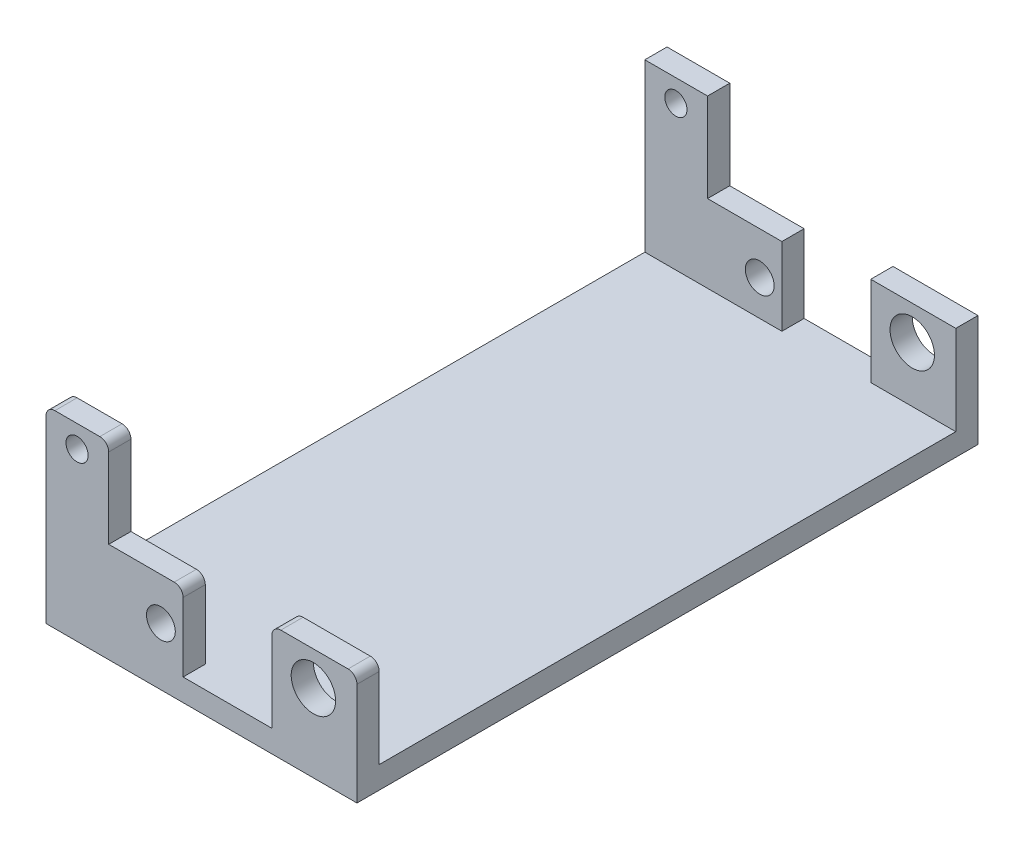
ISO-10303-21;
HEADER;
FILE_DESCRIPTION(('STEP AP214'),'2;1');
FILE_NAME('part.step','',(''),(''),'','','');
FILE_SCHEMA(('AUTOMOTIVE_DESIGN { 1 0 10303 214 1 1 1 1 }'));
ENDSEC;
DATA;
#1=APPLICATION_CONTEXT('core data for automotive mechanical design processes');
#2=APPLICATION_PROTOCOL_DEFINITION('international standard','automotive_design',2000,#1);
#3=PRODUCT_CONTEXT('',#1,'mechanical');
#4=PRODUCT('Part','Part','',(#3));
#5=PRODUCT_RELATED_PRODUCT_CATEGORY('part','',(#4));
#6=PRODUCT_DEFINITION_FORMATION('','',#4);
#7=PRODUCT_DEFINITION_CONTEXT('part definition',#1,'design');
#8=PRODUCT_DEFINITION('design','',#6,#7);
#9=PRODUCT_DEFINITION_SHAPE('','',#8);
#10=(LENGTH_UNIT() NAMED_UNIT(*) SI_UNIT(.MILLI.,.METRE.));
#11=(NAMED_UNIT(*) PLANE_ANGLE_UNIT() SI_UNIT($,.RADIAN.));
#12=(NAMED_UNIT(*) SI_UNIT($,.STERADIAN.) SOLID_ANGLE_UNIT());
#13=UNCERTAINTY_MEASURE_WITH_UNIT(LENGTH_MEASURE(1.E-05),#10,'distance_accuracy_value','');
#14=(GEOMETRIC_REPRESENTATION_CONTEXT(3) GLOBAL_UNCERTAINTY_ASSIGNED_CONTEXT((#13)) GLOBAL_UNIT_ASSIGNED_CONTEXT((#10,
#11,#12)) REPRESENTATION_CONTEXT('',''));
#15=CARTESIAN_POINT('',(0.,0.,0.));
#16=DIRECTION('',(0.,0.,1.));
#17=DIRECTION('',(1.,0.,0.));
#18=AXIS2_PLACEMENT_3D('',#15,#16,#17);
#19=CARTESIAN_POINT('',(0.,3.175,6.35));
#20=DIRECTION('',(0.,-1.,0.));
#21=DIRECTION('',(1.,0.,0.));
#22=AXIS2_PLACEMENT_3D('',#19,#20,#21);
#23=PLANE('',#22);
#24=DIRECTION('',(1.,0.,0.));
#25=VECTOR('',#24,1.);
#26=CARTESIAN_POINT('',(0.,3.175,-164.846));
#27=LINE('',#26,#25);
#28=CARTESIAN_POINT('',(-44.45,3.175,-164.846));
#29=VERTEX_POINT('',#28);
#30=CARTESIAN_POINT('',(-5.26143670644638,3.175,-164.846));
#31=VERTEX_POINT('',#30);
#32=EDGE_CURVE('E57',#29,#31,#27,.T.);
#33=ORIENTED_EDGE('',*,*,#32,.F.);
#34=DIRECTION('',(0.,0.,1.));
#35=VECTOR('',#34,1.);
#36=CARTESIAN_POINT('',(-44.45,3.175,-171.196));
#37=LINE('',#36,#35);
#38=CARTESIAN_POINT('',(-44.45,3.175,0.));
#39=VERTEX_POINT('',#38);
#40=EDGE_CURVE('E303',#29,#39,#37,.T.);
#41=ORIENTED_EDGE('',*,*,#40,.T.);
#42=DIRECTION('',(-1.,0.,0.));
#43=VECTOR('',#42,1.);
#44=CARTESIAN_POINT('',(0.,3.175,0.));
#45=LINE('',#44,#43);
#46=CARTESIAN_POINT('',(-5.26143670644638,3.175,0.));
#47=VERTEX_POINT('',#46);
#48=EDGE_CURVE('E384',#47,#39,#45,.T.);
#49=ORIENTED_EDGE('',*,*,#48,.F.);
#50=DIRECTION('',(0.,0.,-1.));
#51=VECTOR('',#50,1.);
#52=CARTESIAN_POINT('',(-5.26143670644638,3.175,6.35));
#53=LINE('',#52,#51);
#54=CARTESIAN_POINT('',(-5.26143670644638,3.175,6.35));
#55=VERTEX_POINT('',#54);
#56=EDGE_CURVE('E378',#55,#47,#53,.T.);
#57=ORIENTED_EDGE('',*,*,#56,.F.);
#58=DIRECTION('',(-1.,0.,0.));
#59=VECTOR('',#58,1.);
#60=CARTESIAN_POINT('',(0.,3.175,6.35));
#61=LINE('',#60,#59);
#62=CARTESIAN_POINT('',(20.1413299749846,3.175,6.35));
#63=VERTEX_POINT('',#62);
#64=EDGE_CURVE('E322',#63,#55,#61,.T.);
#65=ORIENTED_EDGE('',*,*,#64,.F.);
#66=DIRECTION('',(0.,0.,-1.));
#67=VECTOR('',#66,1.);
#68=CARTESIAN_POINT('',(20.1413299749846,3.175,6.35));
#69=LINE('',#68,#67);
#70=CARTESIAN_POINT('',(20.1413299749846,3.175,0.));
#71=VERTEX_POINT('',#70);
#72=EDGE_CURVE('E381',#63,#71,#69,.T.);
#73=ORIENTED_EDGE('',*,*,#72,.T.);
#74=CARTESIAN_POINT('',(44.45,3.175,0.));
#75=VERTEX_POINT('',#74);
#76=EDGE_CURVE('E387',#75,#71,#45,.T.);
#77=ORIENTED_EDGE('',*,*,#76,.F.);
#78=DIRECTION('',(0.,0.,1.));
#79=VECTOR('',#78,1.);
#80=CARTESIAN_POINT('',(44.45,3.175,-171.196));
#81=LINE('',#80,#79);
#82=CARTESIAN_POINT('',(44.45,3.175,-164.846));
#83=VERTEX_POINT('',#82);
#84=EDGE_CURVE('E302',#83,#75,#81,.T.);
#85=ORIENTED_EDGE('',*,*,#84,.F.);
#86=CARTESIAN_POINT('',(20.1413299749846,3.175,-164.846));
#87=VERTEX_POINT('',#86);
#88=EDGE_CURVE('E50',#87,#83,#27,.T.);
#89=ORIENTED_EDGE('',*,*,#88,.F.);
#90=DIRECTION('',(0.,0.,1.));
#91=VECTOR('',#90,1.);
#92=CARTESIAN_POINT('',(20.1413299749846,3.175,-171.196));
#93=LINE('',#92,#91);
#94=CARTESIAN_POINT('',(20.1413299749846,3.175,-171.196));
#95=VERTEX_POINT('',#94);
#96=EDGE_CURVE('E281',#95,#87,#93,.T.);
#97=ORIENTED_EDGE('',*,*,#96,.F.);
#98=DIRECTION('',(-1.,0.,0.));
#99=VECTOR('',#98,1.);
#100=CARTESIAN_POINT('',(-44.45,3.175,-171.196));
#101=LINE('',#100,#99);
#102=CARTESIAN_POINT('',(-5.26143670644638,3.175,-171.196));
#103=VERTEX_POINT('',#102);
#104=EDGE_CURVE('E212',#95,#103,#101,.T.);
#105=ORIENTED_EDGE('',*,*,#104,.T.);
#106=DIRECTION('',(0.,0.,1.));
#107=VECTOR('',#106,1.);
#108=CARTESIAN_POINT('',(-5.26143670644638,3.175,-171.196));
#109=LINE('',#108,#107);
#110=EDGE_CURVE('E283',#103,#31,#109,.T.);
#111=ORIENTED_EDGE('',*,*,#110,.T.);
#112=EDGE_LOOP('',(#33,#41,#49,#57,#65,#73,#77,#85,#89,#97,#105,#111));
#113=FACE_BOUND('',#112,.T.);
#114=ADVANCED_FACE('F35',(#113),#23,.F.);
#115=CARTESIAN_POINT('',(0.,0.,0.));
#116=DIRECTION('',(0.,0.,1.));
#117=DIRECTION('',(1.,0.,0.));
#118=AXIS2_PLACEMENT_3D('',#115,#116,#117);
#119=PLANE('',#118);
#120=CARTESIAN_POINT('',(31.9955052767469,19.05,0.));
#121=DIRECTION('',(0.,0.,1.));
#122=DIRECTION('',(1.,0.,0.));
#123=AXIS2_PLACEMENT_3D('',#120,#121,#122);
#124=CIRCLE('',#123,6.35000000000001);
#125=CARTESIAN_POINT('',(38.3455052767469,19.05,0.));
#126=VERTEX_POINT('',#125);
#127=EDGE_CURVE('E305',#126,#126,#124,.T.);
#128=ORIENTED_EDGE('',*,*,#127,.T.);
#129=EDGE_LOOP('',(#128));
#130=FACE_BOUND('',#129,.T.);
#131=DIRECTION('',(-1.,0.,0.));
#132=VECTOR('',#131,1.);
#133=CARTESIAN_POINT('',(0.,28.7610986747673,0.));
#134=LINE('',#133,#132);
#135=CARTESIAN_POINT('',(41.91,28.7610986747673,0.));
#136=VERTEX_POINT('',#135);
#137=CARTESIAN_POINT('',(22.6813299749846,28.7610986747673,0.));
#138=VERTEX_POINT('',#137);
#139=EDGE_CURVE('E352',#136,#138,#134,.T.);
#140=ORIENTED_EDGE('',*,*,#139,.F.);
#141=CARTESIAN_POINT('',(41.91,26.2210986747673,0.));
#142=DIRECTION('',(0.,0.,1.));
#143=DIRECTION('',(1.,0.,0.));
#144=AXIS2_PLACEMENT_3D('',#141,#142,#143);
#145=CIRCLE('',#144,2.54);
#146=CARTESIAN_POINT('',(44.45,26.2210986747673,0.));
#147=VERTEX_POINT('',#146);
#148=EDGE_CURVE('E395',#136,#147,#145,.F.);
#149=ORIENTED_EDGE('',*,*,#148,.T.);
#150=DIRECTION('',(0.,1.,0.));
#151=VECTOR('',#150,1.);
#152=CARTESIAN_POINT('',(44.45,0.,0.));
#153=LINE('',#152,#151);
#154=EDGE_CURVE('E311',#75,#147,#153,.T.);
#155=ORIENTED_EDGE('',*,*,#154,.F.);
#156=ORIENTED_EDGE('',*,*,#76,.T.);
#157=DIRECTION('',(0.,-1.,0.));
#158=VECTOR('',#157,1.);
#159=CARTESIAN_POINT('',(20.1413299749846,0.,0.));
#160=LINE('',#159,#158);
#161=CARTESIAN_POINT('',(20.1413299749846,26.2210986747673,0.));
#162=VERTEX_POINT('',#161);
#163=EDGE_CURVE('E355',#162,#71,#160,.T.);
#164=ORIENTED_EDGE('',*,*,#163,.F.);
#165=CARTESIAN_POINT('',(22.6813299749846,26.2210986747673,0.));
#166=DIRECTION('',(0.,0.,1.));
#167=DIRECTION('',(1.,0.,0.));
#168=AXIS2_PLACEMENT_3D('',#165,#166,#167);
#169=CIRCLE('',#168,2.54);
#170=EDGE_CURVE('E393',#162,#138,#169,.F.);
#171=ORIENTED_EDGE('',*,*,#170,.T.);
#172=EDGE_LOOP('',(#140,#149,#155,#156,#164,#171));
#173=FACE_BOUND('',#172,.T.);
#174=ADVANCED_FACE('F476',(#130,#173),#119,.F.);
#175=CARTESIAN_POINT('',(0.,28.7610986747673,6.35));
#176=DIRECTION('',(0.,-1.,0.));
#177=DIRECTION('',(1.,0.,0.));
#178=AXIS2_PLACEMENT_3D('',#175,#176,#177);
#179=PLANE('',#178);
#180=DIRECTION('',(-1.,0.,0.));
#181=VECTOR('',#180,1.);
#182=CARTESIAN_POINT('',(0.,28.7610986747673,6.35));
#183=LINE('',#182,#181);
#184=CARTESIAN_POINT('',(41.91,28.7610986747673,6.35));
#185=VERTEX_POINT('',#184);
#186=CARTESIAN_POINT('',(22.6813299749846,28.7610986747673,6.35));
#187=VERTEX_POINT('',#186);
#188=EDGE_CURVE('E317',#185,#187,#183,.T.);
#189=ORIENTED_EDGE('',*,*,#188,.F.);
#190=DIRECTION('',(0.,0.,-1.));
#191=VECTOR('',#190,1.);
#192=CARTESIAN_POINT('',(41.91,28.7610986747673,6.35));
#193=LINE('',#192,#191);
#194=EDGE_CURVE('E390',#185,#136,#193,.T.);
#195=ORIENTED_EDGE('',*,*,#194,.T.);
#196=ORIENTED_EDGE('',*,*,#139,.T.);
#197=DIRECTION('',(0.,0.,-1.));
#198=VECTOR('',#197,1.);
#199=CARTESIAN_POINT('',(22.6813299749846,28.7610986747673,6.35));
#200=LINE('',#199,#198);
#201=EDGE_CURVE('E388',#138,#187,#200,.F.);
#202=ORIENTED_EDGE('',*,*,#201,.T.);
#203=EDGE_LOOP('',(#189,#195,#196,#202));
#204=FACE_BOUND('',#203,.T.);
#205=ADVANCED_FACE('F473',(#204),#179,.F.);
#206=CARTESIAN_POINT('',(20.1413299749846,0.,6.35));
#207=DIRECTION('',(1.,0.,0.));
#208=DIRECTION('',(0.,0.,-1.));
#209=AXIS2_PLACEMENT_3D('',#206,#207,#208);
#210=PLANE('',#209);
#211=DIRECTION('',(0.,-1.,0.));
#212=VECTOR('',#211,1.);
#213=CARTESIAN_POINT('',(20.1413299749846,0.,6.35));
#214=LINE('',#213,#212);
#215=CARTESIAN_POINT('',(20.1413299749846,26.2210986747673,6.35));
#216=VERTEX_POINT('',#215);
#217=EDGE_CURVE('E320',#216,#63,#214,.T.);
#218=ORIENTED_EDGE('',*,*,#217,.F.);
#219=DIRECTION('',(0.,0.,-1.));
#220=VECTOR('',#219,1.);
#221=CARTESIAN_POINT('',(20.1413299749846,26.2210986747673,6.35));
#222=LINE('',#221,#220);
#223=EDGE_CURVE('E409',#216,#162,#222,.T.);
#224=ORIENTED_EDGE('',*,*,#223,.T.);
#225=ORIENTED_EDGE('',*,*,#163,.T.);
#226=ORIENTED_EDGE('',*,*,#72,.F.);
#227=EDGE_LOOP('',(#218,#224,#225,#226));
#228=FACE_BOUND('',#227,.T.);
#229=ADVANCED_FACE('F486',(#228),#210,.F.);
#230=CARTESIAN_POINT('',(-5.26143670644638,0.,6.35));
#231=DIRECTION('',(1.,0.,0.));
#232=DIRECTION('',(0.,1.,0.));
#233=AXIS2_PLACEMENT_3D('',#230,#231,#232);
#234=PLANE('',#233);
#235=DIRECTION('',(0.,-1.,0.));
#236=VECTOR('',#235,1.);
#237=CARTESIAN_POINT('',(-5.26143670644638,0.,0.));
#238=LINE('',#237,#236);
#239=CARTESIAN_POINT('',(-5.26143670644638,22.86,0.));
#240=VERTEX_POINT('',#239);
#241=EDGE_CURVE('E357',#240,#47,#238,.T.);
#242=ORIENTED_EDGE('',*,*,#241,.F.);
#243=DIRECTION('',(0.,0.,-1.));
#244=VECTOR('',#243,1.);
#245=CARTESIAN_POINT('',(-5.26143670644638,22.86,6.35));
#246=LINE('',#245,#244);
#247=CARTESIAN_POINT('',(-5.26143670644638,22.86,6.35));
#248=VERTEX_POINT('',#247);
#249=EDGE_CURVE('E421',#240,#248,#246,.F.);
#250=ORIENTED_EDGE('',*,*,#249,.T.);
#251=DIRECTION('',(0.,-1.,0.));
#252=VECTOR('',#251,1.);
#253=CARTESIAN_POINT('',(-5.26143670644638,0.,6.35));
#254=LINE('',#253,#252);
#255=EDGE_CURVE('E325',#248,#55,#254,.T.);
#256=ORIENTED_EDGE('',*,*,#255,.T.);
#257=ORIENTED_EDGE('',*,*,#56,.T.);
#258=EDGE_LOOP('',(#242,#250,#256,#257));
#259=FACE_BOUND('',#258,.T.);
#260=ADVANCED_FACE('F522',(#259),#234,.T.);
#261=CARTESIAN_POINT('',(0.,25.4,6.35));
#262=DIRECTION('',(0.,1.,0.));
#263=DIRECTION('',(0.,0.,1.));
#264=AXIS2_PLACEMENT_3D('',#261,#262,#263);
#265=PLANE('',#264);
#266=DIRECTION('',(1.,0.,0.));
#267=VECTOR('',#266,1.);
#268=CARTESIAN_POINT('',(0.,25.4,6.35));
#269=LINE('',#268,#267);
#270=CARTESIAN_POINT('',(-26.5176,25.4,6.35));
#271=VERTEX_POINT('',#270);
#272=CARTESIAN_POINT('',(-7.80143670644638,25.4,6.35));
#273=VERTEX_POINT('',#272);
#274=EDGE_CURVE('E327',#271,#273,#269,.T.);
#275=ORIENTED_EDGE('',*,*,#274,.T.);
#276=DIRECTION('',(0.,0.,-1.));
#277=VECTOR('',#276,1.);
#278=CARTESIAN_POINT('',(-7.80143670644638,25.4,6.35));
#279=LINE('',#278,#277);
#280=CARTESIAN_POINT('',(-7.80143670644638,25.4,0.));
#281=VERTEX_POINT('',#280);
#282=EDGE_CURVE('E412',#273,#281,#279,.T.);
#283=ORIENTED_EDGE('',*,*,#282,.T.);
#284=DIRECTION('',(1.,0.,0.));
#285=VECTOR('',#284,1.);
#286=CARTESIAN_POINT('',(0.,25.4,0.));
#287=LINE('',#286,#285);
#288=CARTESIAN_POINT('',(-26.5176,25.4,0.));
#289=VERTEX_POINT('',#288);
#290=EDGE_CURVE('E359',#289,#281,#287,.T.);
#291=ORIENTED_EDGE('',*,*,#290,.F.);
#292=DIRECTION('',(0.,0.,-1.));
#293=VECTOR('',#292,1.);
#294=CARTESIAN_POINT('',(-26.5176,25.4,6.35));
#295=LINE('',#294,#293);
#296=EDGE_CURVE('E375',#271,#289,#295,.T.);
#297=ORIENTED_EDGE('',*,*,#296,.F.);
#298=EDGE_LOOP('',(#275,#283,#291,#297));
#299=FACE_BOUND('',#298,.T.);
#300=ADVANCED_FACE('F565',(#299),#265,.T.);
#301=CARTESIAN_POINT('',(-26.5176,0.,6.35));
#302=DIRECTION('',(1.,0.,0.));
#303=DIRECTION('',(0.,1.,0.));
#304=AXIS2_PLACEMENT_3D('',#301,#302,#303);
#305=PLANE('',#304);
#306=DIRECTION('',(0.,-1.,0.));
#307=VECTOR('',#306,1.);
#308=CARTESIAN_POINT('',(-26.5176,0.,0.));
#309=LINE('',#308,#307);
#310=CARTESIAN_POINT('',(-26.5176,48.26,0.));
#311=VERTEX_POINT('',#310);
#312=EDGE_CURVE('E362',#311,#289,#309,.T.);
#313=ORIENTED_EDGE('',*,*,#312,.F.);
#314=DIRECTION('',(0.,0.,-1.));
#315=VECTOR('',#314,1.);
#316=CARTESIAN_POINT('',(-26.5176,48.26,6.35));
#317=LINE('',#316,#315);
#318=CARTESIAN_POINT('',(-26.5176,48.26,6.35));
#319=VERTEX_POINT('',#318);
#320=EDGE_CURVE('E11',#311,#319,#317,.F.);
#321=ORIENTED_EDGE('',*,*,#320,.T.);
#322=DIRECTION('',(0.,-1.,0.));
#323=VECTOR('',#322,1.);
#324=CARTESIAN_POINT('',(-26.5176,0.,6.35));
#325=LINE('',#324,#323);
#326=EDGE_CURVE('E330',#319,#271,#325,.T.);
#327=ORIENTED_EDGE('',*,*,#326,.T.);
#328=ORIENTED_EDGE('',*,*,#296,.T.);
#329=EDGE_LOOP('',(#313,#321,#327,#328));
#330=FACE_BOUND('',#329,.T.);
#331=ADVANCED_FACE('F560',(#330),#305,.T.);
#332=CARTESIAN_POINT('',(0.,50.8,6.35));
#333=DIRECTION('',(0.,1.,0.));
#334=DIRECTION('',(0.,0.,1.));
#335=AXIS2_PLACEMENT_3D('',#332,#333,#334);
#336=PLANE('',#335);
#337=DIRECTION('',(1.,0.,0.));
#338=VECTOR('',#337,1.);
#339=CARTESIAN_POINT('',(0.,50.8,0.));
#340=LINE('',#339,#338);
#341=CARTESIAN_POINT('',(-41.91,50.8,0.));
#342=VERTEX_POINT('',#341);
#343=CARTESIAN_POINT('',(-29.0576,50.8,0.));
#344=VERTEX_POINT('',#343);
#345=EDGE_CURVE('E364',#342,#344,#340,.T.);
#346=ORIENTED_EDGE('',*,*,#345,.F.);
#347=DIRECTION('',(0.,0.,-1.));
#348=VECTOR('',#347,1.);
#349=CARTESIAN_POINT('',(-41.91,50.8,6.35));
#350=LINE('',#349,#348);
#351=CARTESIAN_POINT('',(-41.91,50.8,6.35));
#352=VERTEX_POINT('',#351);
#353=EDGE_CURVE('E43',#342,#352,#350,.F.);
#354=ORIENTED_EDGE('',*,*,#353,.T.);
#355=DIRECTION('',(1.,0.,0.));
#356=VECTOR('',#355,1.);
#357=CARTESIAN_POINT('',(0.,50.8,6.35));
#358=LINE('',#357,#356);
#359=CARTESIAN_POINT('',(-29.0576,50.8,6.35));
#360=VERTEX_POINT('',#359);
#361=EDGE_CURVE('E332',#352,#360,#358,.T.);
#362=ORIENTED_EDGE('',*,*,#361,.T.);
#363=DIRECTION('',(0.,0.,-1.));
#364=VECTOR('',#363,1.);
#365=CARTESIAN_POINT('',(-29.0576,50.8,6.35));
#366=LINE('',#365,#364);
#367=EDGE_CURVE('E426',#360,#344,#366,.T.);
#368=ORIENTED_EDGE('',*,*,#367,.T.);
#369=EDGE_LOOP('',(#346,#354,#362,#368));
#370=FACE_BOUND('',#369,.T.);
#371=ADVANCED_FACE('F432',(#370),#336,.T.);
#372=CARTESIAN_POINT('',(-44.45,0.,6.35));
#373=DIRECTION('',(-1.,0.,0.));
#374=DIRECTION('',(0.,0.,1.));
#375=AXIS2_PLACEMENT_3D('',#372,#373,#374);
#376=PLANE('',#375);
#377=DIRECTION('',(0.,-1.,0.));
#378=VECTOR('',#377,1.);
#379=CARTESIAN_POINT('',(-44.45,-3.17500000000001,-171.196));
#380=LINE('',#379,#378);
#381=CARTESIAN_POINT('',(-44.45,50.8,-171.196));
#382=VERTEX_POINT('',#381);
#383=CARTESIAN_POINT('',(-44.45,-3.17500000000001,-171.196));
#384=VERTEX_POINT('',#383);
#385=EDGE_CURVE('E297',#382,#384,#380,.T.);
#386=ORIENTED_EDGE('',*,*,#385,.T.);
#387=DIRECTION('',(0.,0.,-1.));
#388=VECTOR('',#387,1.);
#389=CARTESIAN_POINT('',(-44.45,-3.17500000000001,6.35));
#390=LINE('',#389,#388);
#391=CARTESIAN_POINT('',(-44.45,-3.17500000000001,6.35));
#392=VERTEX_POINT('',#391);
#393=EDGE_CURVE('E373',#392,#384,#390,.T.);
#394=ORIENTED_EDGE('',*,*,#393,.F.);
#395=DIRECTION('',(0.,1.,0.));
#396=VECTOR('',#395,1.);
#397=CARTESIAN_POINT('',(-44.45,0.,6.35));
#398=LINE('',#397,#396);
#399=CARTESIAN_POINT('',(-44.45,48.26,6.35));
#400=VERTEX_POINT('',#399);
#401=EDGE_CURVE('E335',#392,#400,#398,.T.);
#402=ORIENTED_EDGE('',*,*,#401,.T.);
#403=DIRECTION('',(0.,0.,-1.));
#404=VECTOR('',#403,1.);
#405=CARTESIAN_POINT('',(-44.45,48.26,6.35));
#406=LINE('',#405,#404);
#407=CARTESIAN_POINT('',(-44.45,48.26,0.));
#408=VERTEX_POINT('',#407);
#409=EDGE_CURVE('E423',#400,#408,#406,.T.);
#410=ORIENTED_EDGE('',*,*,#409,.T.);
#411=DIRECTION('',(0.,1.,0.));
#412=VECTOR('',#411,1.);
#413=CARTESIAN_POINT('',(-44.45,0.,0.));
#414=LINE('',#413,#412);
#415=EDGE_CURVE('E367',#39,#408,#414,.T.);
#416=ORIENTED_EDGE('',*,*,#415,.F.);
#417=ORIENTED_EDGE('',*,*,#40,.F.);
#418=DIRECTION('',(0.,1.,0.));
#419=VECTOR('',#418,1.);
#420=CARTESIAN_POINT('',(-44.45,0.,-164.846));
#421=LINE('',#420,#419);
#422=CARTESIAN_POINT('',(-44.45,50.8,-164.846));
#423=VERTEX_POINT('',#422);
#424=EDGE_CURVE('E262',#29,#423,#421,.T.);
#425=ORIENTED_EDGE('',*,*,#424,.T.);
#426=DIRECTION('',(0.,0.,1.));
#427=VECTOR('',#426,1.);
#428=CARTESIAN_POINT('',(-44.45,50.8,-171.196));
#429=LINE('',#428,#427);
#430=EDGE_CURVE('E222',#382,#423,#429,.T.);
#431=ORIENTED_EDGE('',*,*,#430,.F.);
#432=EDGE_LOOP('',(#386,#394,#402,#410,#416,#417,#425,#431));
#433=FACE_BOUND('',#432,.T.);
#434=ADVANCED_FACE('F446',(#433),#376,.T.);
#435=CARTESIAN_POINT('',(0.,-3.175,6.35));
#436=DIRECTION('',(0.,-1.,0.));
#437=DIRECTION('',(1.,0.,0.));
#438=AXIS2_PLACEMENT_3D('',#435,#436,#437);
#439=PLANE('',#438);
#440=DIRECTION('',(1.,0.,0.));
#441=VECTOR('',#440,1.);
#442=CARTESIAN_POINT('',(-44.45,-3.17500000000001,-171.196));
#443=LINE('',#442,#441);
#444=CARTESIAN_POINT('',(44.45,-3.17500000000001,-171.196));
#445=VERTEX_POINT('',#444);
#446=EDGE_CURVE('E213',#384,#445,#443,.T.);
#447=ORIENTED_EDGE('',*,*,#446,.T.);
#448=DIRECTION('',(0.,0.,-1.));
#449=VECTOR('',#448,1.);
#450=CARTESIAN_POINT('',(44.45,-3.17499999999999,6.35));
#451=LINE('',#450,#449);
#452=CARTESIAN_POINT('',(44.45,-3.17499999999999,6.35));
#453=VERTEX_POINT('',#452);
#454=EDGE_CURVE('E207',#453,#445,#451,.T.);
#455=ORIENTED_EDGE('',*,*,#454,.F.);
#456=DIRECTION('',(-1.,0.,0.));
#457=VECTOR('',#456,1.);
#458=CARTESIAN_POINT('',(0.,-3.175,6.35));
#459=LINE('',#458,#457);
#460=EDGE_CURVE('E338',#453,#392,#459,.T.);
#461=ORIENTED_EDGE('',*,*,#460,.T.);
#462=ORIENTED_EDGE('',*,*,#393,.T.);
#463=EDGE_LOOP('',(#447,#455,#461,#462));
#464=FACE_BOUND('',#463,.T.);
#465=ADVANCED_FACE('F463',(#464),#439,.T.);
#466=CARTESIAN_POINT('',(-35.5684947232531,44.45,6.35));
#467=DIRECTION('',(0.,0.,-1.));
#468=DIRECTION('',(-1.,0.,0.));
#469=AXIS2_PLACEMENT_3D('',#466,#467,#468);
#470=CYLINDRICAL_SURFACE('',#469,3.175);
#471=CARTESIAN_POINT('',(-35.5684947232531,44.45,6.35));
#472=DIRECTION('',(0.,0.,1.));
#473=DIRECTION('',(1.,0.,0.));
#474=AXIS2_PLACEMENT_3D('',#471,#472,#473);
#475=CIRCLE('',#474,3.175);
#476=CARTESIAN_POINT('',(-32.3934947232531,44.45,6.35));
#477=VERTEX_POINT('',#476);
#478=EDGE_CURVE('E314',#477,#477,#475,.T.);
#479=ORIENTED_EDGE('',*,*,#478,.T.);
#480=EDGE_LOOP('',(#479));
#481=FACE_BOUND('',#480,.T.);
#482=CARTESIAN_POINT('',(-35.5684947232531,44.45,0.));
#483=DIRECTION('',(0.,0.,1.));
#484=DIRECTION('',(1.,0.,0.));
#485=AXIS2_PLACEMENT_3D('',#482,#483,#484);
#486=CIRCLE('',#485,3.175);
#487=CARTESIAN_POINT('',(-32.3934947232531,44.45,0.));
#488=VERTEX_POINT('',#487);
#489=EDGE_CURVE('E349',#488,#488,#486,.T.);
#490=ORIENTED_EDGE('',*,*,#489,.F.);
#491=EDGE_LOOP('',(#490));
#492=FACE_BOUND('',#491,.T.);
#493=ADVANCED_FACE('F528',(#481,#492),#470,.F.);
#494=CARTESIAN_POINT('',(-11.6022154109893,13.3103245475766,6.35));
#495=DIRECTION('',(0.,0.,-1.));
#496=DIRECTION('',(-1.,0.,0.));
#497=AXIS2_PLACEMENT_3D('',#494,#495,#496);
#498=CYLINDRICAL_SURFACE('',#497,4.1192851017764);
#499=CARTESIAN_POINT('',(-11.6022154109893,13.3103245475766,6.35));
#500=DIRECTION('',(0.,0.,1.));
#501=DIRECTION('',(1.,0.,0.));
#502=AXIS2_PLACEMENT_3D('',#499,#500,#501);
#503=CIRCLE('',#502,4.1192851017764);
#504=CARTESIAN_POINT('',(-7.48293030921291,13.3103245475766,6.35));
#505=VERTEX_POINT('',#504);
#506=EDGE_CURVE('E310',#505,#505,#503,.T.);
#507=ORIENTED_EDGE('',*,*,#506,.T.);
#508=EDGE_LOOP('',(#507));
#509=FACE_BOUND('',#508,.T.);
#510=CARTESIAN_POINT('',(-11.6022154109893,13.3103245475766,0.));
#511=DIRECTION('',(0.,0.,1.));
#512=DIRECTION('',(1.,0.,0.));
#513=AXIS2_PLACEMENT_3D('',#510,#511,#512);
#514=CIRCLE('',#513,4.1192851017764);
#515=CARTESIAN_POINT('',(-7.48293030921291,13.3103245475766,0.));
#516=VERTEX_POINT('',#515);
#517=EDGE_CURVE('E346',#516,#516,#514,.T.);
#518=ORIENTED_EDGE('',*,*,#517,.F.);
#519=EDGE_LOOP('',(#518));
#520=FACE_BOUND('',#519,.T.);
#521=ADVANCED_FACE('F531',(#509,#520),#498,.F.);
#522=CARTESIAN_POINT('',(31.9955052767469,19.05,6.35));
#523=DIRECTION('',(0.,0.,-1.));
#524=DIRECTION('',(-1.,0.,0.));
#525=AXIS2_PLACEMENT_3D('',#522,#523,#524);
#526=CYLINDRICAL_SURFACE('',#525,6.35000000000001);
#527=CARTESIAN_POINT('',(31.9955052767469,19.05,6.35));
#528=DIRECTION('',(0.,0.,1.));
#529=DIRECTION('',(1.,0.,0.));
#530=AXIS2_PLACEMENT_3D('',#527,#528,#529);
#531=CIRCLE('',#530,6.35000000000001);
#532=CARTESIAN_POINT('',(38.3455052767469,19.05,6.35));
#533=VERTEX_POINT('',#532);
#534=EDGE_CURVE('E307',#533,#533,#531,.T.);
#535=ORIENTED_EDGE('',*,*,#534,.T.);
#536=EDGE_LOOP('',(#535));
#537=FACE_BOUND('',#536,.T.);
#538=ORIENTED_EDGE('',*,*,#127,.F.);
#539=EDGE_LOOP('',(#538));
#540=FACE_BOUND('',#539,.T.);
#541=ADVANCED_FACE('F535',(#537,#540),#526,.F.);
#542=CARTESIAN_POINT('',(44.45,0.,6.35));
#543=DIRECTION('',(-1.,0.,0.));
#544=DIRECTION('',(0.,0.,1.));
#545=AXIS2_PLACEMENT_3D('',#542,#543,#544);
#546=PLANE('',#545);
#547=DIRECTION('',(0.,1.,0.));
#548=VECTOR('',#547,1.);
#549=CARTESIAN_POINT('',(44.45,-3.17500000000001,-171.196));
#550=LINE('',#549,#548);
#551=CARTESIAN_POINT('',(44.45,28.7610986747673,-171.196));
#552=VERTEX_POINT('',#551);
#553=EDGE_CURVE('E200',#445,#552,#550,.T.);
#554=ORIENTED_EDGE('',*,*,#553,.T.);
#555=DIRECTION('',(0.,0.,1.));
#556=VECTOR('',#555,1.);
#557=CARTESIAN_POINT('',(44.45,28.7610986747673,-171.196));
#558=LINE('',#557,#556);
#559=CARTESIAN_POINT('',(44.45,28.7610986747673,-164.846));
#560=VERTEX_POINT('',#559);
#561=EDGE_CURVE('E204',#552,#560,#558,.T.);
#562=ORIENTED_EDGE('',*,*,#561,.T.);
#563=DIRECTION('',(0.,1.,0.));
#564=VECTOR('',#563,1.);
#565=CARTESIAN_POINT('',(44.45,0.,-164.846));
#566=LINE('',#565,#564);
#567=EDGE_CURVE('E260',#83,#560,#566,.T.);
#568=ORIENTED_EDGE('',*,*,#567,.F.);
#569=ORIENTED_EDGE('',*,*,#84,.T.);
#570=ORIENTED_EDGE('',*,*,#154,.T.);
#571=DIRECTION('',(0.,0.,-1.));
#572=VECTOR('',#571,1.);
#573=CARTESIAN_POINT('',(44.45,26.2210986747673,6.35));
#574=LINE('',#573,#572);
#575=CARTESIAN_POINT('',(44.45,26.2210986747673,6.35));
#576=VERTEX_POINT('',#575);
#577=EDGE_CURVE('E397',#147,#576,#574,.F.);
#578=ORIENTED_EDGE('',*,*,#577,.T.);
#579=DIRECTION('',(0.,1.,0.));
#580=VECTOR('',#579,1.);
#581=CARTESIAN_POINT('',(44.45,0.,6.35));
#582=LINE('',#581,#580);
#583=EDGE_CURVE('E341',#453,#576,#582,.T.);
#584=ORIENTED_EDGE('',*,*,#583,.F.);
#585=ORIENTED_EDGE('',*,*,#454,.T.);
#586=EDGE_LOOP('',(#554,#562,#568,#569,#570,#578,#584,#585));
#587=FACE_BOUND('',#586,.T.);
#588=ADVANCED_FACE('F202',(#587),#546,.F.);
#589=CARTESIAN_POINT('',(0.,0.,6.35));
#590=DIRECTION('',(0.,0.,1.));
#591=DIRECTION('',(1.,0.,0.));
#592=AXIS2_PLACEMENT_3D('',#589,#590,#591);
#593=PLANE('',#592);
#594=ORIENTED_EDGE('',*,*,#583,.T.);
#595=CARTESIAN_POINT('',(41.91,26.2210986747673,6.35));
#596=DIRECTION('',(0.,0.,1.));
#597=DIRECTION('',(1.,0.,0.));
#598=AXIS2_PLACEMENT_3D('',#595,#596,#597);
#599=CIRCLE('',#598,2.54);
#600=EDGE_CURVE('E407',#576,#185,#599,.T.);
#601=ORIENTED_EDGE('',*,*,#600,.T.);
#602=ORIENTED_EDGE('',*,*,#188,.T.);
#603=CARTESIAN_POINT('',(22.6813299749846,26.2210986747673,6.35));
#604=DIRECTION('',(0.,0.,1.));
#605=DIRECTION('',(1.,0.,0.));
#606=AXIS2_PLACEMENT_3D('',#603,#604,#605);
#607=CIRCLE('',#606,2.54);
#608=EDGE_CURVE('E405',#187,#216,#607,.T.);
#609=ORIENTED_EDGE('',*,*,#608,.T.);
#610=ORIENTED_EDGE('',*,*,#217,.T.);
#611=ORIENTED_EDGE('',*,*,#64,.T.);
#612=ORIENTED_EDGE('',*,*,#255,.F.);
#613=CARTESIAN_POINT('',(-7.80143670644638,22.86,6.35));
#614=DIRECTION('',(0.,0.,1.));
#615=DIRECTION('',(1.,0.,0.));
#616=AXIS2_PLACEMENT_3D('',#613,#614,#615);
#617=CIRCLE('',#616,2.54);
#618=EDGE_CURVE('E403',#248,#273,#617,.T.);
#619=ORIENTED_EDGE('',*,*,#618,.T.);
#620=ORIENTED_EDGE('',*,*,#274,.F.);
#621=ORIENTED_EDGE('',*,*,#326,.F.);
#622=CARTESIAN_POINT('',(-29.0576,48.26,6.35));
#623=DIRECTION('',(0.,0.,1.));
#624=DIRECTION('',(1.,0.,0.));
#625=AXIS2_PLACEMENT_3D('',#622,#623,#624);
#626=CIRCLE('',#625,2.54);
#627=EDGE_CURVE('E399',#319,#360,#626,.T.);
#628=ORIENTED_EDGE('',*,*,#627,.T.);
#629=ORIENTED_EDGE('',*,*,#361,.F.);
#630=CARTESIAN_POINT('',(-41.91,48.26,6.35));
#631=DIRECTION('',(0.,0.,1.));
#632=DIRECTION('',(1.,0.,0.));
#633=AXIS2_PLACEMENT_3D('',#630,#631,#632);
#634=CIRCLE('',#633,2.54);
#635=EDGE_CURVE('E401',#352,#400,#634,.T.);
#636=ORIENTED_EDGE('',*,*,#635,.T.);
#637=ORIENTED_EDGE('',*,*,#401,.F.);
#638=ORIENTED_EDGE('',*,*,#460,.F.);
#639=EDGE_LOOP('',(#594,#601,#602,#609,#610,#611,#612,#619,#620,#621,#628,#629,#636,#637,#638));
#640=FACE_BOUND('',#639,.T.);
#641=ORIENTED_EDGE('',*,*,#506,.F.);
#642=EDGE_LOOP('',(#641));
#643=FACE_BOUND('',#642,.T.);
#644=ORIENTED_EDGE('',*,*,#478,.F.);
#645=EDGE_LOOP('',(#644));
#646=FACE_BOUND('',#645,.T.);
#647=ORIENTED_EDGE('',*,*,#534,.F.);
#648=EDGE_LOOP('',(#647));
#649=FACE_BOUND('',#648,.T.);
#650=ADVANCED_FACE('F437',(#640,#643,#646,#649),#593,.T.);
#651=ORIENTED_EDGE('',*,*,#517,.T.);
#652=EDGE_LOOP('',(#651));
#653=FACE_BOUND('',#652,.T.);
#654=ORIENTED_EDGE('',*,*,#489,.T.);
#655=EDGE_LOOP('',(#654));
#656=FACE_BOUND('',#655,.T.);
#657=ORIENTED_EDGE('',*,*,#290,.T.);
#658=CARTESIAN_POINT('',(-7.80143670644638,22.86,0.));
#659=DIRECTION('',(0.,0.,1.));
#660=DIRECTION('',(1.,0.,0.));
#661=AXIS2_PLACEMENT_3D('',#658,#659,#660);
#662=CIRCLE('',#661,2.54);
#663=EDGE_CURVE('E419',#281,#240,#662,.F.);
#664=ORIENTED_EDGE('',*,*,#663,.T.);
#665=ORIENTED_EDGE('',*,*,#241,.T.);
#666=ORIENTED_EDGE('',*,*,#48,.T.);
#667=ORIENTED_EDGE('',*,*,#415,.T.);
#668=CARTESIAN_POINT('',(-41.91,48.26,0.));
#669=DIRECTION('',(0.,0.,1.));
#670=DIRECTION('',(1.,0.,0.));
#671=AXIS2_PLACEMENT_3D('',#668,#669,#670);
#672=CIRCLE('',#671,2.54);
#673=EDGE_CURVE('E417',#408,#342,#672,.F.);
#674=ORIENTED_EDGE('',*,*,#673,.T.);
#675=ORIENTED_EDGE('',*,*,#345,.T.);
#676=CARTESIAN_POINT('',(-29.0576,48.26,0.));
#677=DIRECTION('',(0.,0.,1.));
#678=DIRECTION('',(1.,0.,0.));
#679=AXIS2_PLACEMENT_3D('',#676,#677,#678);
#680=CIRCLE('',#679,2.54);
#681=EDGE_CURVE('E415',#344,#311,#680,.F.);
#682=ORIENTED_EDGE('',*,*,#681,.T.);
#683=ORIENTED_EDGE('',*,*,#312,.T.);
#684=EDGE_LOOP('',(#657,#664,#665,#666,#667,#674,#675,#682,#683));
#685=FACE_BOUND('',#684,.T.);
#686=ADVANCED_FACE('F448',(#653,#656,#685),#119,.F.);
#687=CARTESIAN_POINT('',(0.,0.,-171.196));
#688=DIRECTION('',(0.,0.,-1.));
#689=DIRECTION('',(-1.,0.,0.));
#690=AXIS2_PLACEMENT_3D('',#687,#688,#689);
#691=PLANE('',#690);
#692=ORIENTED_EDGE('',*,*,#385,.F.);
#693=DIRECTION('',(1.,0.,0.));
#694=VECTOR('',#693,1.);
#695=CARTESIAN_POINT('',(0.,50.8,-171.196));
#696=LINE('',#695,#694);
#697=CARTESIAN_POINT('',(-26.5176,50.8,-171.196));
#698=VERTEX_POINT('',#697);
#699=EDGE_CURVE('E229',#382,#698,#696,.T.);
#700=ORIENTED_EDGE('',*,*,#699,.T.);
#701=DIRECTION('',(0.,-1.,0.));
#702=VECTOR('',#701,1.);
#703=CARTESIAN_POINT('',(-26.5176,0.,-171.196));
#704=LINE('',#703,#702);
#705=CARTESIAN_POINT('',(-26.5176,25.4,-171.196));
#706=VERTEX_POINT('',#705);
#707=EDGE_CURVE('E233',#698,#706,#704,.T.);
#708=ORIENTED_EDGE('',*,*,#707,.T.);
#709=DIRECTION('',(1.,0.,0.));
#710=VECTOR('',#709,1.);
#711=CARTESIAN_POINT('',(0.,25.4,-171.196));
#712=LINE('',#711,#710);
#713=CARTESIAN_POINT('',(-5.26143670644639,25.4,-171.196));
#714=VERTEX_POINT('',#713);
#715=EDGE_CURVE('E242',#706,#714,#712,.T.);
#716=ORIENTED_EDGE('',*,*,#715,.T.);
#717=DIRECTION('',(0.,-1.,0.));
#718=VECTOR('',#717,1.);
#719=CARTESIAN_POINT('',(-5.26143670644638,0.,-171.196));
#720=LINE('',#719,#718);
#721=EDGE_CURVE('E245',#714,#103,#720,.T.);
#722=ORIENTED_EDGE('',*,*,#721,.T.);
#723=ORIENTED_EDGE('',*,*,#104,.F.);
#724=DIRECTION('',(0.,-1.,0.));
#725=VECTOR('',#724,1.);
#726=CARTESIAN_POINT('',(20.1413299749846,0.,-171.196));
#727=LINE('',#726,#725);
#728=CARTESIAN_POINT('',(20.1413299749846,28.7610986747673,-171.196));
#729=VERTEX_POINT('',#728);
#730=EDGE_CURVE('E228',#729,#95,#727,.T.);
#731=ORIENTED_EDGE('',*,*,#730,.F.);
#732=DIRECTION('',(-1.,0.,0.));
#733=VECTOR('',#732,1.);
#734=CARTESIAN_POINT('',(0.,28.7610986747673,-171.196));
#735=LINE('',#734,#733);
#736=EDGE_CURVE('E218',#552,#729,#735,.T.);
#737=ORIENTED_EDGE('',*,*,#736,.F.);
#738=ORIENTED_EDGE('',*,*,#553,.F.);
#739=ORIENTED_EDGE('',*,*,#446,.F.);
#740=EDGE_LOOP('',(#692,#700,#708,#716,#722,#723,#731,#737,#738,#739));
#741=FACE_BOUND('',#740,.T.);
#742=CARTESIAN_POINT('',(31.9955052767469,19.05,-171.196));
#743=DIRECTION('',(0.,0.,1.));
#744=DIRECTION('',(1.,0.,0.));
#745=AXIS2_PLACEMENT_3D('',#742,#743,#744);
#746=CIRCLE('',#745,6.35000000000001);
#747=CARTESIAN_POINT('',(38.3455052767469,19.05,-171.196));
#748=VERTEX_POINT('',#747);
#749=EDGE_CURVE('E279',#748,#748,#746,.T.);
#750=ORIENTED_EDGE('',*,*,#749,.T.);
#751=EDGE_LOOP('',(#750));
#752=FACE_BOUND('',#751,.T.);
#753=CARTESIAN_POINT('',(-35.5684947232531,44.45,-171.196));
#754=DIRECTION('',(0.,0.,1.));
#755=DIRECTION('',(1.,0.,0.));
#756=AXIS2_PLACEMENT_3D('',#753,#754,#755);
#757=CIRCLE('',#756,3.175);
#758=CARTESIAN_POINT('',(-32.3934947232531,44.45,-171.196));
#759=VERTEX_POINT('',#758);
#760=EDGE_CURVE('E230',#759,#759,#757,.T.);
#761=ORIENTED_EDGE('',*,*,#760,.T.);
#762=EDGE_LOOP('',(#761));
#763=FACE_BOUND('',#762,.T.);
#764=CARTESIAN_POINT('',(-11.6022154109893,13.3103245475766,-171.196));
#765=DIRECTION('',(0.,0.,1.));
#766=DIRECTION('',(1.,0.,0.));
#767=AXIS2_PLACEMENT_3D('',#764,#765,#766);
#768=CIRCLE('',#767,4.1192851017764);
#769=CARTESIAN_POINT('',(-7.48293030921291,13.3103245475766,-171.196));
#770=VERTEX_POINT('',#769);
#771=EDGE_CURVE('E236',#770,#770,#768,.T.);
#772=ORIENTED_EDGE('',*,*,#771,.T.);
#773=EDGE_LOOP('',(#772));
#774=FACE_BOUND('',#773,.T.);
#775=ADVANCED_FACE('F224',(#741,#752,#763,#774),#691,.T.);
#776=CARTESIAN_POINT('',(41.91,26.2210986747673,6.35));
#777=DIRECTION('',(0.,0.,-1.));
#778=DIRECTION('',(-1.,0.,0.));
#779=AXIS2_PLACEMENT_3D('',#776,#777,#778);
#780=CYLINDRICAL_SURFACE('',#779,2.54);
#781=ORIENTED_EDGE('',*,*,#600,.F.);
#782=ORIENTED_EDGE('',*,*,#577,.F.);
#783=ORIENTED_EDGE('',*,*,#148,.F.);
#784=ORIENTED_EDGE('',*,*,#194,.F.);
#785=EDGE_LOOP('',(#781,#782,#783,#784));
#786=FACE_BOUND('',#785,.T.);
#787=ADVANCED_FACE('F470',(#786),#780,.T.);
#788=CARTESIAN_POINT('',(22.6813299749846,26.2210986747673,6.35));
#789=DIRECTION('',(0.,0.,-1.));
#790=DIRECTION('',(-1.,0.,0.));
#791=AXIS2_PLACEMENT_3D('',#788,#789,#790);
#792=CYLINDRICAL_SURFACE('',#791,2.54);
#793=ORIENTED_EDGE('',*,*,#608,.F.);
#794=ORIENTED_EDGE('',*,*,#201,.F.);
#795=ORIENTED_EDGE('',*,*,#170,.F.);
#796=ORIENTED_EDGE('',*,*,#223,.F.);
#797=EDGE_LOOP('',(#793,#794,#795,#796));
#798=FACE_BOUND('',#797,.T.);
#799=ADVANCED_FACE('F483',(#798),#792,.T.);
#800=CARTESIAN_POINT('',(-7.80143670644638,22.86,6.35));
#801=DIRECTION('',(0.,0.,-1.));
#802=DIRECTION('',(-1.,0.,0.));
#803=AXIS2_PLACEMENT_3D('',#800,#801,#802);
#804=CYLINDRICAL_SURFACE('',#803,2.54);
#805=ORIENTED_EDGE('',*,*,#618,.F.);
#806=ORIENTED_EDGE('',*,*,#249,.F.);
#807=ORIENTED_EDGE('',*,*,#663,.F.);
#808=ORIENTED_EDGE('',*,*,#282,.F.);
#809=EDGE_LOOP('',(#805,#806,#807,#808));
#810=FACE_BOUND('',#809,.T.);
#811=ADVANCED_FACE('F544',(#810),#804,.T.);
#812=CARTESIAN_POINT('',(-41.91,48.26,6.35));
#813=DIRECTION('',(0.,0.,-1.));
#814=DIRECTION('',(-1.,0.,0.));
#815=AXIS2_PLACEMENT_3D('',#812,#813,#814);
#816=CYLINDRICAL_SURFACE('',#815,2.54);
#817=ORIENTED_EDGE('',*,*,#635,.F.);
#818=ORIENTED_EDGE('',*,*,#353,.F.);
#819=ORIENTED_EDGE('',*,*,#673,.F.);
#820=ORIENTED_EDGE('',*,*,#409,.F.);
#821=EDGE_LOOP('',(#817,#818,#819,#820));
#822=FACE_BOUND('',#821,.T.);
#823=ADVANCED_FACE('F443',(#822),#816,.T.);
#824=CARTESIAN_POINT('',(-29.0576,48.26,6.35));
#825=DIRECTION('',(0.,0.,-1.));
#826=DIRECTION('',(-1.,0.,0.));
#827=AXIS2_PLACEMENT_3D('',#824,#825,#826);
#828=CYLINDRICAL_SURFACE('',#827,2.54);
#829=ORIENTED_EDGE('',*,*,#627,.F.);
#830=ORIENTED_EDGE('',*,*,#320,.F.);
#831=ORIENTED_EDGE('',*,*,#681,.F.);
#832=ORIENTED_EDGE('',*,*,#367,.F.);
#833=EDGE_LOOP('',(#829,#830,#831,#832));
#834=FACE_BOUND('',#833,.T.);
#835=ADVANCED_FACE('F37',(#834),#828,.T.);
#836=CARTESIAN_POINT('',(0.,28.7610986747673,-171.196));
#837=DIRECTION('',(0.,1.,0.));
#838=DIRECTION('',(-1.,0.,0.));
#839=AXIS2_PLACEMENT_3D('',#836,#837,#838);
#840=PLANE('',#839);
#841=DIRECTION('',(-1.,0.,0.));
#842=VECTOR('',#841,1.);
#843=CARTESIAN_POINT('',(0.,28.7610986747673,-164.846));
#844=LINE('',#843,#842);
#845=CARTESIAN_POINT('',(20.1413299749846,28.7610986747673,-164.846));
#846=VERTEX_POINT('',#845);
#847=EDGE_CURVE('E221',#560,#846,#844,.T.);
#848=ORIENTED_EDGE('',*,*,#847,.F.);
#849=ORIENTED_EDGE('',*,*,#561,.F.);
#850=ORIENTED_EDGE('',*,*,#736,.T.);
#851=DIRECTION('',(0.,0.,1.));
#852=VECTOR('',#851,1.);
#853=CARTESIAN_POINT('',(20.1413299749846,28.7610986747673,-171.196));
#854=LINE('',#853,#852);
#855=EDGE_CURVE('E249',#729,#846,#854,.T.);
#856=ORIENTED_EDGE('',*,*,#855,.T.);
#857=EDGE_LOOP('',(#848,#849,#850,#856));
#858=FACE_BOUND('',#857,.T.);
#859=ADVANCED_FACE('F217',(#858),#840,.T.);
#860=CARTESIAN_POINT('',(31.9955052767469,19.05,-171.196));
#861=DIRECTION('',(0.,0.,1.));
#862=DIRECTION('',(1.,0.,0.));
#863=AXIS2_PLACEMENT_3D('',#860,#861,#862);
#864=CYLINDRICAL_SURFACE('',#863,6.35000000000001);
#865=ORIENTED_EDGE('',*,*,#749,.F.);
#866=EDGE_LOOP('',(#865));
#867=FACE_BOUND('',#866,.T.);
#868=CARTESIAN_POINT('',(31.9955052767469,19.05,-164.846));
#869=DIRECTION('',(0.,0.,1.));
#870=DIRECTION('',(1.,0.,0.));
#871=AXIS2_PLACEMENT_3D('',#868,#869,#870);
#872=CIRCLE('',#871,6.35000000000001);
#873=CARTESIAN_POINT('',(38.3455052767469,19.05,-164.846));
#874=VERTEX_POINT('',#873);
#875=EDGE_CURVE('E250',#874,#874,#872,.T.);
#876=ORIENTED_EDGE('',*,*,#875,.T.);
#877=EDGE_LOOP('',(#876));
#878=FACE_BOUND('',#877,.T.);
#879=ADVANCED_FACE('F555',(#867,#878),#864,.F.);
#880=CARTESIAN_POINT('',(0.,0.,-164.846));
#881=DIRECTION('',(0.,0.,-1.));
#882=DIRECTION('',(1.,0.,0.));
#883=AXIS2_PLACEMENT_3D('',#880,#881,#882);
#884=PLANE('',#883);
#885=ORIENTED_EDGE('',*,*,#875,.F.);
#886=EDGE_LOOP('',(#885));
#887=FACE_BOUND('',#886,.T.);
#888=DIRECTION('',(0.,-1.,0.));
#889=VECTOR('',#888,1.);
#890=CARTESIAN_POINT('',(20.1413299749846,0.,-164.846));
#891=LINE('',#890,#889);
#892=EDGE_CURVE('E276',#846,#87,#891,.T.);
#893=ORIENTED_EDGE('',*,*,#892,.T.);
#894=ORIENTED_EDGE('',*,*,#88,.T.);
#895=ORIENTED_EDGE('',*,*,#567,.T.);
#896=ORIENTED_EDGE('',*,*,#847,.T.);
#897=EDGE_LOOP('',(#893,#894,#895,#896));
#898=FACE_BOUND('',#897,.T.);
#899=ADVANCED_FACE('F492',(#887,#898),#884,.F.);
#900=CARTESIAN_POINT('',(20.1413299749846,0.,-171.196));
#901=DIRECTION('',(-1.,0.,0.));
#902=DIRECTION('',(0.,0.,1.));
#903=AXIS2_PLACEMENT_3D('',#900,#901,#902);
#904=PLANE('',#903);
#905=ORIENTED_EDGE('',*,*,#892,.F.);
#906=ORIENTED_EDGE('',*,*,#855,.F.);
#907=ORIENTED_EDGE('',*,*,#730,.T.);
#908=ORIENTED_EDGE('',*,*,#96,.T.);
#909=EDGE_LOOP('',(#905,#906,#907,#908));
#910=FACE_BOUND('',#909,.T.);
#911=ADVANCED_FACE('F495',(#910),#904,.T.);
#912=CARTESIAN_POINT('',(-11.6022154109893,13.3103245475766,-164.846));
#913=DIRECTION('',(0.,0.,1.));
#914=DIRECTION('',(1.,0.,0.));
#915=AXIS2_PLACEMENT_3D('',#912,#913,#914);
#916=CIRCLE('',#915,4.1192851017764);
#917=CARTESIAN_POINT('',(-7.48293030921291,13.3103245475766,-164.846));
#918=VERTEX_POINT('',#917);
#919=EDGE_CURVE('E253',#918,#918,#916,.T.);
#920=ORIENTED_EDGE('',*,*,#919,.F.);
#921=EDGE_LOOP('',(#920));
#922=FACE_BOUND('',#921,.T.);
#923=CARTESIAN_POINT('',(-35.5684947232531,44.45,-164.846));
#924=DIRECTION('',(0.,0.,1.));
#925=DIRECTION('',(1.,0.,0.));
#926=AXIS2_PLACEMENT_3D('',#923,#924,#925);
#927=CIRCLE('',#926,3.175);
#928=CARTESIAN_POINT('',(-32.3934947232531,44.45,-164.846));
#929=VERTEX_POINT('',#928);
#930=EDGE_CURVE('E256',#929,#929,#927,.T.);
#931=ORIENTED_EDGE('',*,*,#930,.F.);
#932=EDGE_LOOP('',(#931));
#933=FACE_BOUND('',#932,.T.);
#934=ORIENTED_EDGE('',*,*,#424,.F.);
#935=ORIENTED_EDGE('',*,*,#32,.T.);
#936=DIRECTION('',(0.,-1.,0.));
#937=VECTOR('',#936,1.);
#938=CARTESIAN_POINT('',(-5.26143670644638,0.,-164.846));
#939=LINE('',#938,#937);
#940=CARTESIAN_POINT('',(-5.26143670644639,25.4,-164.846));
#941=VERTEX_POINT('',#940);
#942=EDGE_CURVE('E273',#941,#31,#939,.T.);
#943=ORIENTED_EDGE('',*,*,#942,.F.);
#944=DIRECTION('',(1.,0.,0.));
#945=VECTOR('',#944,1.);
#946=CARTESIAN_POINT('',(0.,25.4,-164.846));
#947=LINE('',#946,#945);
#948=CARTESIAN_POINT('',(-26.5176,25.4,-164.846));
#949=VERTEX_POINT('',#948);
#950=EDGE_CURVE('E270',#949,#941,#947,.T.);
#951=ORIENTED_EDGE('',*,*,#950,.F.);
#952=DIRECTION('',(0.,-1.,0.));
#953=VECTOR('',#952,1.);
#954=CARTESIAN_POINT('',(-26.5176,0.,-164.846));
#955=LINE('',#954,#953);
#956=CARTESIAN_POINT('',(-26.5176,50.8,-164.846));
#957=VERTEX_POINT('',#956);
#958=EDGE_CURVE('E267',#957,#949,#955,.T.);
#959=ORIENTED_EDGE('',*,*,#958,.F.);
#960=DIRECTION('',(1.,0.,0.));
#961=VECTOR('',#960,1.);
#962=CARTESIAN_POINT('',(0.,50.8,-164.846));
#963=LINE('',#962,#961);
#964=EDGE_CURVE('E264',#423,#957,#963,.T.);
#965=ORIENTED_EDGE('',*,*,#964,.F.);
#966=EDGE_LOOP('',(#934,#935,#943,#951,#959,#965));
#967=FACE_BOUND('',#966,.T.);
#968=ADVANCED_FACE('F457',(#922,#933,#967),#884,.F.);
#969=CARTESIAN_POINT('',(0.,50.8,-171.196));
#970=DIRECTION('',(0.,-1.,0.));
#971=DIRECTION('',(0.,0.,-1.));
#972=AXIS2_PLACEMENT_3D('',#969,#970,#971);
#973=PLANE('',#972);
#974=ORIENTED_EDGE('',*,*,#964,.T.);
#975=DIRECTION('',(0.,0.,1.));
#976=VECTOR('',#975,1.);
#977=CARTESIAN_POINT('',(-26.5176,50.8,-171.196));
#978=LINE('',#977,#976);
#979=EDGE_CURVE('E291',#698,#957,#978,.T.);
#980=ORIENTED_EDGE('',*,*,#979,.F.);
#981=ORIENTED_EDGE('',*,*,#699,.F.);
#982=ORIENTED_EDGE('',*,*,#430,.T.);
#983=EDGE_LOOP('',(#974,#980,#981,#982));
#984=FACE_BOUND('',#983,.T.);
#985=ADVANCED_FACE('F461',(#984),#973,.F.);
#986=CARTESIAN_POINT('',(-26.5176,0.,-171.196));
#987=DIRECTION('',(-1.,0.,0.));
#988=DIRECTION('',(0.,-1.,0.));
#989=AXIS2_PLACEMENT_3D('',#986,#987,#988);
#990=PLANE('',#989);
#991=ORIENTED_EDGE('',*,*,#958,.T.);
#992=DIRECTION('',(0.,0.,1.));
#993=VECTOR('',#992,1.);
#994=CARTESIAN_POINT('',(-26.5176,25.4,-171.196));
#995=LINE('',#994,#993);
#996=EDGE_CURVE('E288',#706,#949,#995,.T.);
#997=ORIENTED_EDGE('',*,*,#996,.F.);
#998=ORIENTED_EDGE('',*,*,#707,.F.);
#999=ORIENTED_EDGE('',*,*,#979,.T.);
#1000=EDGE_LOOP('',(#991,#997,#998,#999));
#1001=FACE_BOUND('',#1000,.T.);
#1002=ADVANCED_FACE('F504',(#1001),#990,.F.);
#1003=CARTESIAN_POINT('',(0.,25.4,-171.196));
#1004=DIRECTION('',(0.,-1.,0.));
#1005=DIRECTION('',(0.,0.,-1.));
#1006=AXIS2_PLACEMENT_3D('',#1003,#1004,#1005);
#1007=PLANE('',#1006);
#1008=ORIENTED_EDGE('',*,*,#950,.T.);
#1009=DIRECTION('',(0.,0.,1.));
#1010=VECTOR('',#1009,1.);
#1011=CARTESIAN_POINT('',(-5.26143670644639,25.4,-171.196));
#1012=LINE('',#1011,#1010);
#1013=EDGE_CURVE('E285',#714,#941,#1012,.T.);
#1014=ORIENTED_EDGE('',*,*,#1013,.F.);
#1015=ORIENTED_EDGE('',*,*,#715,.F.);
#1016=ORIENTED_EDGE('',*,*,#996,.T.);
#1017=EDGE_LOOP('',(#1008,#1014,#1015,#1016));
#1018=FACE_BOUND('',#1017,.T.);
#1019=ADVANCED_FACE('F502',(#1018),#1007,.F.);
#1020=CARTESIAN_POINT('',(-5.26143670644638,0.,-171.196));
#1021=DIRECTION('',(-1.,0.,0.));
#1022=DIRECTION('',(0.,-1.,0.));
#1023=AXIS2_PLACEMENT_3D('',#1020,#1021,#1022);
#1024=PLANE('',#1023);
#1025=ORIENTED_EDGE('',*,*,#942,.T.);
#1026=ORIENTED_EDGE('',*,*,#110,.F.);
#1027=ORIENTED_EDGE('',*,*,#721,.F.);
#1028=ORIENTED_EDGE('',*,*,#1013,.T.);
#1029=EDGE_LOOP('',(#1025,#1026,#1027,#1028));
#1030=FACE_BOUND('',#1029,.T.);
#1031=ADVANCED_FACE('F499',(#1030),#1024,.F.);
#1032=CARTESIAN_POINT('',(-35.5684947232531,44.45,-171.196));
#1033=DIRECTION('',(0.,0.,1.));
#1034=DIRECTION('',(1.,0.,0.));
#1035=AXIS2_PLACEMENT_3D('',#1032,#1033,#1034);
#1036=CYLINDRICAL_SURFACE('',#1035,3.175);
#1037=ORIENTED_EDGE('',*,*,#760,.F.);
#1038=EDGE_LOOP('',(#1037));
#1039=FACE_BOUND('',#1038,.T.);
#1040=ORIENTED_EDGE('',*,*,#930,.T.);
#1041=EDGE_LOOP('',(#1040));
#1042=FACE_BOUND('',#1041,.T.);
#1043=ADVANCED_FACE('F598',(#1039,#1042),#1036,.F.);
#1044=CARTESIAN_POINT('',(-11.6022154109893,13.3103245475766,-171.196));
#1045=DIRECTION('',(0.,0.,1.));
#1046=DIRECTION('',(1.,0.,0.));
#1047=AXIS2_PLACEMENT_3D('',#1044,#1045,#1046);
#1048=CYLINDRICAL_SURFACE('',#1047,4.1192851017764);
#1049=ORIENTED_EDGE('',*,*,#771,.F.);
#1050=EDGE_LOOP('',(#1049));
#1051=FACE_BOUND('',#1050,.T.);
#1052=ORIENTED_EDGE('',*,*,#919,.T.);
#1053=EDGE_LOOP('',(#1052));
#1054=FACE_BOUND('',#1053,.T.);
#1055=ADVANCED_FACE('F595',(#1051,#1054),#1048,.F.);
#1056=CLOSED_SHELL('',(#114,#174,#205,#229,#260,#300,#331,#371,#434,#465,#493,#521,#541,#588,
#650,#686,#775,#787,#799,#811,#823,#835,#859,#879,#899,#911,#968,#985,#1002,#1019,#1031,#1043,#1055));
#1057=MANIFOLD_SOLID_BREP('B2',#1056);
#1058=ADVANCED_BREP_SHAPE_REPRESENTATION('',(#18,#1057),#14);
#1059=SHAPE_DEFINITION_REPRESENTATION(#9,#1058);
ENDSEC;
END-ISO-10303-21;
